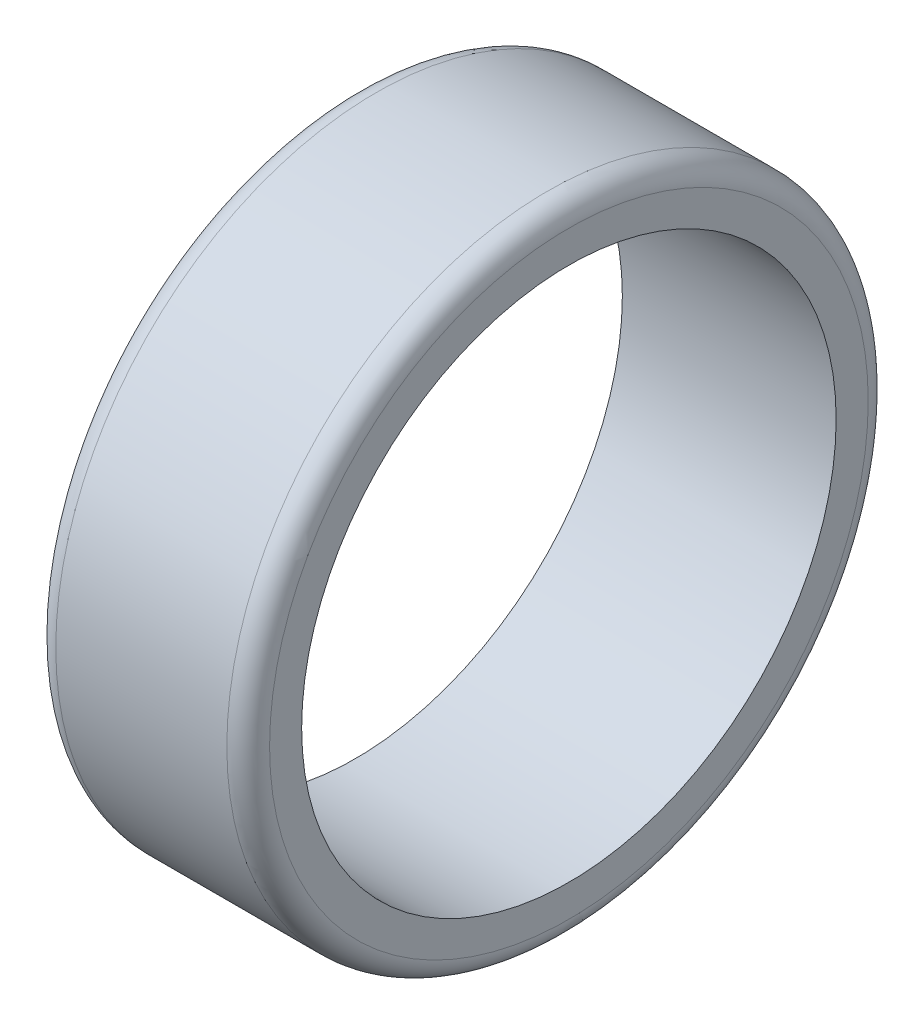
ISO-10303-21;
HEADER;
FILE_DESCRIPTION(('STEP AP214'),'2;1');
FILE_NAME('part.step','',(''),(''),'','','');
FILE_SCHEMA(('AUTOMOTIVE_DESIGN { 1 0 10303 214 1 1 1 1 }'));
ENDSEC;
DATA;
#1=APPLICATION_CONTEXT('core data for automotive mechanical design processes');
#2=APPLICATION_PROTOCOL_DEFINITION('international standard','automotive_design',2000,#1);
#3=PRODUCT_CONTEXT('',#1,'mechanical');
#4=PRODUCT('Part','Part','',(#3));
#5=PRODUCT_RELATED_PRODUCT_CATEGORY('part','',(#4));
#6=PRODUCT_DEFINITION_FORMATION('','',#4);
#7=PRODUCT_DEFINITION_CONTEXT('part definition',#1,'design');
#8=PRODUCT_DEFINITION('design','',#6,#7);
#9=PRODUCT_DEFINITION_SHAPE('','',#8);
#10=(LENGTH_UNIT() NAMED_UNIT(*) SI_UNIT(.MILLI.,.METRE.));
#11=(NAMED_UNIT(*) PLANE_ANGLE_UNIT() SI_UNIT($,.RADIAN.));
#12=(NAMED_UNIT(*) SI_UNIT($,.STERADIAN.) SOLID_ANGLE_UNIT());
#13=UNCERTAINTY_MEASURE_WITH_UNIT(LENGTH_MEASURE(1.E-05),#10,'distance_accuracy_value','');
#14=(GEOMETRIC_REPRESENTATION_CONTEXT(3) GLOBAL_UNCERTAINTY_ASSIGNED_CONTEXT((#13)) GLOBAL_UNIT_ASSIGNED_CONTEXT((#10,
#11,#12)) REPRESENTATION_CONTEXT('',''));
#15=CARTESIAN_POINT('',(0.,0.,0.));
#16=DIRECTION('',(0.,0.,1.));
#17=DIRECTION('',(1.,0.,0.));
#18=AXIS2_PLACEMENT_3D('',#15,#16,#17);
#19=CARTESIAN_POINT('',(3.,15.,0.));
#20=DIRECTION('',(1.,0.,0.));
#21=DIRECTION('',(0.,0.,-1.));
#22=AXIS2_PLACEMENT_3D('',#19,#20,#21);
#23=PLANE('',#22);
#24=CARTESIAN_POINT('',(3.,0.,0.));
#25=DIRECTION('',(1.,0.,0.));
#26=DIRECTION('',(0.,0.,-1.));
#27=AXIS2_PLACEMENT_3D('',#24,#25,#26);
#28=CIRCLE('',#27,14.);
#29=CARTESIAN_POINT('',(3.,0.,-14.));
#30=VERTEX_POINT('',#29);
#31=EDGE_CURVE('E47',#30,#30,#28,.F.);
#32=ORIENTED_EDGE('',*,*,#31,.T.);
#33=EDGE_LOOP('',(#32));
#34=FACE_BOUND('',#33,.T.);
#35=CARTESIAN_POINT('',(3.,0.,0.));
#36=DIRECTION('',(-1.,0.,0.));
#37=DIRECTION('',(0.,0.,1.));
#38=AXIS2_PLACEMENT_3D('',#35,#36,#37);
#39=CIRCLE('',#38,12.5);
#40=CARTESIAN_POINT('',(3.,0.,12.5));
#41=VERTEX_POINT('',#40);
#42=EDGE_CURVE('E52',#41,#41,#39,.T.);
#43=ORIENTED_EDGE('',*,*,#42,.F.);
#44=EDGE_LOOP('',(#43));
#45=FACE_BOUND('',#44,.T.);
#46=ADVANCED_FACE('F32',(#34,#45),#23,.F.);
#47=CARTESIAN_POINT('',(0.,0.,0.));
#48=DIRECTION('',(-1.,0.,0.));
#49=DIRECTION('',(0.,0.,1.));
#50=AXIS2_PLACEMENT_3D('',#47,#48,#49);
#51=CYLINDRICAL_SURFACE('',#50,12.5);
#52=CARTESIAN_POINT('',(13.,0.,0.));
#53=DIRECTION('',(-1.,0.,0.));
#54=DIRECTION('',(0.,0.,1.));
#55=AXIS2_PLACEMENT_3D('',#52,#53,#54);
#56=CIRCLE('',#55,12.5);
#57=CARTESIAN_POINT('',(13.,0.,12.5));
#58=VERTEX_POINT('',#57);
#59=EDGE_CURVE('E55',#58,#58,#56,.T.);
#60=ORIENTED_EDGE('',*,*,#59,.F.);
#61=EDGE_LOOP('',(#60));
#62=FACE_BOUND('',#61,.T.);
#63=ORIENTED_EDGE('',*,*,#42,.T.);
#64=EDGE_LOOP('',(#63));
#65=FACE_BOUND('',#64,.T.);
#66=ADVANCED_FACE('F61',(#62,#65),#51,.F.);
#67=CARTESIAN_POINT('',(13.,15.,0.));
#68=DIRECTION('',(-1.,0.,0.));
#69=DIRECTION('',(0.,0.,1.));
#70=AXIS2_PLACEMENT_3D('',#67,#68,#69);
#71=PLANE('',#70);
#72=CARTESIAN_POINT('',(13.,0.,0.));
#73=DIRECTION('',(-1.,0.,0.));
#74=DIRECTION('',(0.,0.,1.));
#75=AXIS2_PLACEMENT_3D('',#72,#73,#74);
#76=CIRCLE('',#75,14.);
#77=CARTESIAN_POINT('',(13.,0.,14.));
#78=VERTEX_POINT('',#77);
#79=EDGE_CURVE('E10',#78,#78,#76,.F.);
#80=ORIENTED_EDGE('',*,*,#79,.T.);
#81=EDGE_LOOP('',(#80));
#82=FACE_BOUND('',#81,.T.);
#83=ORIENTED_EDGE('',*,*,#59,.T.);
#84=EDGE_LOOP('',(#83));
#85=FACE_BOUND('',#84,.T.);
#86=ADVANCED_FACE('F59',(#82,#85),#71,.F.);
#87=CARTESIAN_POINT('',(0.,0.,0.));
#88=DIRECTION('',(-1.,0.,0.));
#89=DIRECTION('',(0.,0.,1.));
#90=AXIS2_PLACEMENT_3D('',#87,#88,#89);
#91=CYLINDRICAL_SURFACE('',#90,15.);
#92=CARTESIAN_POINT('',(4.,0.,0.));
#93=DIRECTION('',(1.,0.,0.));
#94=DIRECTION('',(0.,0.,-1.));
#95=AXIS2_PLACEMENT_3D('',#92,#93,#94);
#96=CIRCLE('',#95,15.);
#97=CARTESIAN_POINT('',(4.,0.,-15.));
#98=VERTEX_POINT('',#97);
#99=EDGE_CURVE('E39',#98,#98,#96,.T.);
#100=ORIENTED_EDGE('',*,*,#99,.T.);
#101=EDGE_LOOP('',(#100));
#102=FACE_BOUND('',#101,.T.);
#103=CARTESIAN_POINT('',(12.,0.,0.));
#104=DIRECTION('',(-1.,0.,0.));
#105=DIRECTION('',(0.,0.,1.));
#106=AXIS2_PLACEMENT_3D('',#103,#104,#105);
#107=CIRCLE('',#106,15.);
#108=CARTESIAN_POINT('',(12.,0.,15.));
#109=VERTEX_POINT('',#108);
#110=EDGE_CURVE('E43',#109,#109,#107,.T.);
#111=ORIENTED_EDGE('',*,*,#110,.T.);
#112=EDGE_LOOP('',(#111));
#113=FACE_BOUND('',#112,.T.);
#114=ADVANCED_FACE('F75',(#102,#113),#91,.T.);
#115=CARTESIAN_POINT('',(4.,0.,0.));
#116=DIRECTION('',(1.,0.,0.));
#117=DIRECTION('',(0.,0.,-1.));
#118=AXIS2_PLACEMENT_3D('',#115,#116,#117);
#119=TOROIDAL_SURFACE('',#118,14.,1.);
#120=ORIENTED_EDGE('',*,*,#99,.F.);
#121=EDGE_LOOP('',(#120));
#122=FACE_BOUND('',#121,.T.);
#123=ORIENTED_EDGE('',*,*,#31,.F.);
#124=EDGE_LOOP('',(#123));
#125=FACE_BOUND('',#124,.T.);
#126=ADVANCED_FACE('F73',(#122,#125),#119,.T.);
#127=CARTESIAN_POINT('',(12.,0.,0.));
#128=DIRECTION('',(-1.,0.,0.));
#129=DIRECTION('',(0.,0.,1.));
#130=AXIS2_PLACEMENT_3D('',#127,#128,#129);
#131=TOROIDAL_SURFACE('',#130,14.,1.);
#132=ORIENTED_EDGE('',*,*,#79,.F.);
#133=EDGE_LOOP('',(#132));
#134=FACE_BOUND('',#133,.T.);
#135=ORIENTED_EDGE('',*,*,#110,.F.);
#136=EDGE_LOOP('',(#135));
#137=FACE_BOUND('',#136,.T.);
#138=ADVANCED_FACE('F34',(#134,#137),#131,.T.);
#139=CLOSED_SHELL('',(#46,#66,#86,#114,#126,#138));
#140=MANIFOLD_SOLID_BREP('B2',#139);
#141=ADVANCED_BREP_SHAPE_REPRESENTATION('',(#18,#140),#14);
#142=SHAPE_DEFINITION_REPRESENTATION(#9,#141);
ENDSEC;
END-ISO-10303-21;
